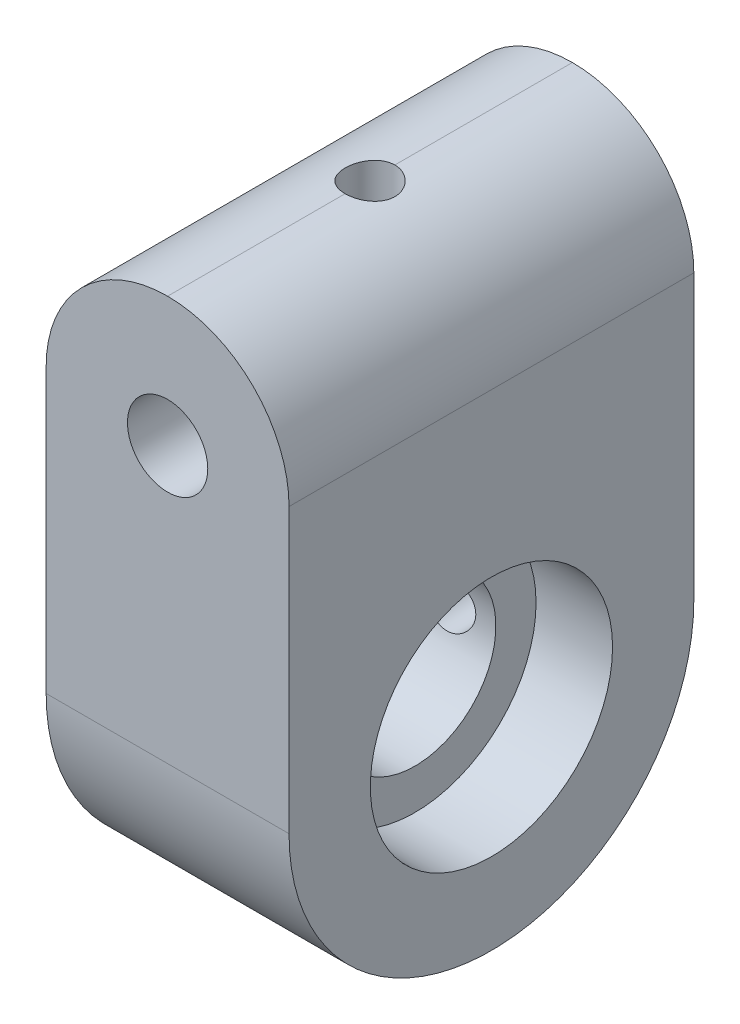
ISO-10303-21;
HEADER;
FILE_DESCRIPTION(('STEP AP214'),'2;1');
FILE_NAME('part.step','',(''),(''),'','','');
FILE_SCHEMA(('AUTOMOTIVE_DESIGN { 1 0 10303 214 1 1 1 1 }'));
ENDSEC;
DATA;
#1=APPLICATION_CONTEXT('core data for automotive mechanical design processes');
#2=APPLICATION_PROTOCOL_DEFINITION('international standard','automotive_design',2000,#1);
#3=PRODUCT_CONTEXT('',#1,'mechanical');
#4=PRODUCT('Part','Part','',(#3));
#5=PRODUCT_RELATED_PRODUCT_CATEGORY('part','',(#4));
#6=PRODUCT_DEFINITION_FORMATION('','',#4);
#7=PRODUCT_DEFINITION_CONTEXT('part definition',#1,'design');
#8=PRODUCT_DEFINITION('design','',#6,#7);
#9=PRODUCT_DEFINITION_SHAPE('','',#8);
#10=(LENGTH_UNIT() NAMED_UNIT(*) SI_UNIT(.MILLI.,.METRE.));
#11=(NAMED_UNIT(*) PLANE_ANGLE_UNIT() SI_UNIT($,.RADIAN.));
#12=(NAMED_UNIT(*) SI_UNIT($,.STERADIAN.) SOLID_ANGLE_UNIT());
#13=UNCERTAINTY_MEASURE_WITH_UNIT(LENGTH_MEASURE(1.E-05),#10,'distance_accuracy_value','');
#14=(GEOMETRIC_REPRESENTATION_CONTEXT(3) GLOBAL_UNCERTAINTY_ASSIGNED_CONTEXT((#13)) GLOBAL_UNIT_ASSIGNED_CONTEXT((#10,
#11,#12)) REPRESENTATION_CONTEXT('',''));
#15=CARTESIAN_POINT('',(0.,0.,0.));
#16=DIRECTION('',(0.,0.,1.));
#17=DIRECTION('',(1.,0.,0.));
#18=AXIS2_PLACEMENT_3D('',#15,#16,#17);
#19=CARTESIAN_POINT('',(6.,0.,0.));
#20=DIRECTION('',(-1.,0.,0.));
#21=DIRECTION('',(0.,0.,1.));
#22=AXIS2_PLACEMENT_3D('',#19,#20,#21);
#23=CYLINDRICAL_SURFACE('',#22,15.875);
#24=CARTESIAN_POINT('',(6.,0.,0.));
#25=DIRECTION('',(1.,0.,0.));
#26=DIRECTION('',(0.,0.,-1.));
#27=AXIS2_PLACEMENT_3D('',#24,#25,#26);
#28=CIRCLE('',#27,15.875);
#29=CARTESIAN_POINT('',(6.,0.,15.875));
#30=VERTEX_POINT('',#29);
#31=CARTESIAN_POINT('',(6.,0.,-15.875));
#32=VERTEX_POINT('',#31);
#33=EDGE_CURVE('E154',#30,#32,#28,.T.);
#34=ORIENTED_EDGE('',*,*,#33,.F.);
#35=DIRECTION('',(-1.,0.,0.));
#36=VECTOR('',#35,1.);
#37=CARTESIAN_POINT('',(50.9012806053458,0.,15.875));
#38=LINE('',#37,#36);
#39=CARTESIAN_POINT('',(-13.0500000112,0.,15.875));
#40=VERTEX_POINT('',#39);
#41=EDGE_CURVE('E130',#30,#40,#38,.T.);
#42=ORIENTED_EDGE('',*,*,#41,.T.);
#43=CARTESIAN_POINT('',(-13.0500000112,0.,0.));
#44=DIRECTION('',(-1.,0.,0.));
#45=DIRECTION('',(0.,0.,1.));
#46=AXIS2_PLACEMENT_3D('',#43,#44,#45);
#47=CIRCLE('',#46,15.875);
#48=CARTESIAN_POINT('',(-13.0500000112,0.,-15.875));
#49=VERTEX_POINT('',#48);
#50=EDGE_CURVE('E123',#49,#40,#47,.T.);
#51=ORIENTED_EDGE('',*,*,#50,.F.);
#52=DIRECTION('',(-1.,0.,0.));
#53=VECTOR('',#52,1.);
#54=CARTESIAN_POINT('',(50.9012806053458,0.,-15.875));
#55=LINE('',#54,#53);
#56=CARTESIAN_POINT('',(-5.4750000056,0.,-15.875));
#57=VERTEX_POINT('',#56);
#58=EDGE_CURVE('E107',#57,#49,#55,.T.);
#59=ORIENTED_EDGE('',*,*,#58,.F.);
#60=CARTESIAN_POINT('',(-5.4750000056,0.,-15.875));
#61=CARTESIAN_POINT('',(-5.47499536164466,0.109091635657176,-15.8749984996695));
#62=CARTESIAN_POINT('',(-5.46581453993797,0.218251818472943,-15.8738636145146));
#63=CARTESIAN_POINT('',(-5.4293347624982,0.433535697956955,-15.8694454930914));
#64=CARTESIAN_POINT('',(-5.40201678914125,0.539656085297117,-15.8661600018665));
#65=CARTESIAN_POINT('',(-5.3300787858362,0.745712449431408,-15.8578108676735));
#66=CARTESIAN_POINT('',(-5.28547028865571,0.84565249709462,-15.8527484101529));
#67=CARTESIAN_POINT('',(-5.18024247086433,1.03660848917392,-15.8414086787376));
#68=CARTESIAN_POINT('',(-5.11962593816166,1.12762598373223,-15.8351316164254));
#69=CARTESIAN_POINT('',(-4.98375758915348,1.29865705097452,-15.8220263564267));
#70=CARTESIAN_POINT('',(-4.90843760378764,1.37861628530336,-15.8151956818049));
#71=CARTESIAN_POINT('',(-4.74544670232929,1.52479318956466,-15.8017730760334));
#72=CARTESIAN_POINT('',(-4.65777516290659,1.59101016556668,-15.7951811569537));
#73=CARTESIAN_POINT('',(-4.47221782939643,1.70802443854119,-15.7829579712837));
#74=CARTESIAN_POINT('',(-4.37429979851413,1.7587709771967,-15.7773298929554));
#75=CARTESIAN_POINT('',(-4.17125080177959,1.84307971870168,-15.7677041311081));
#76=CARTESIAN_POINT('',(-4.06612010041798,1.87664255130086,-15.7637063878414));
#77=CARTESIAN_POINT('',(-3.85219320309525,1.92546638135259,-15.7578174905465));
#78=CARTESIAN_POINT('',(-3.74341821202189,1.94081899669899,-15.755915794494));
#79=CARTESIAN_POINT('',(-3.52482027996539,1.95307005739227,-15.7544020087318));
#80=CARTESIAN_POINT('',(-3.41499737989185,1.94996922022953,-15.7547898300032));
#81=CARTESIAN_POINT('',(-3.19805893685664,1.92547663300571,-15.7578016136163));
#82=CARTESIAN_POINT('',(-3.09093181393696,1.90418571907383,-15.760413248052));
#83=CARTESIAN_POINT('',(-2.88178257957178,1.84407463713728,-15.7675591624959));
#84=CARTESIAN_POINT('',(-2.7797605683515,1.80525412513567,-15.7720934802344));
#85=CARTESIAN_POINT('',(-2.58340382756519,1.71107715813541,-15.7825878564819));
#86=CARTESIAN_POINT('',(-2.4890903665214,1.65567679683265,-15.7885516921479));
#87=CARTESIAN_POINT('',(-2.31106096572575,1.52994416648238,-15.8012301856438));
#88=CARTESIAN_POINT('',(-2.22734549438724,1.45961123780799,-15.8079448766355));
#89=CARTESIAN_POINT('',(-2.07230309900676,1.30545071422877,-15.8214233193507));
#90=CARTESIAN_POINT('',(-2.00106258608573,1.22153618770746,-15.8281870994146));
#91=CARTESIAN_POINT('',(-1.8736648872185,1.04289405190826,-15.8409596477729));
#92=CARTESIAN_POINT('',(-1.8175077340502,0.948166419132862,-15.8469684144266));
#93=CARTESIAN_POINT('',(-1.72187112170528,0.750521045852015,-15.8575574594906));
#94=CARTESIAN_POINT('',(-1.68239697538903,0.647600708684002,-15.8621372827191));
#95=CARTESIAN_POINT('',(-1.62131499884889,0.436523797186398,-15.8693482491345));
#96=CARTESIAN_POINT('',(-1.59970636108679,0.328367459763015,-15.8719794803991));
#97=CARTESIAN_POINT('',(-1.57508056116937,0.110635972316938,-15.8749853589123));
#98=CARTESIAN_POINT('',(-1.5719443438791,0.00107447921691601,-15.8753744564066));
#99=CARTESIAN_POINT('',(-1.58403836447204,-0.21701253776651,-15.873891216281));
#100=CARTESIAN_POINT('',(-1.59926822495188,-0.325538082891355,-15.8720189251303));
#101=CARTESIAN_POINT('',(-1.64756318919314,-0.538121998648205,-15.8662323078876));
#102=CARTESIAN_POINT('',(-1.68057162316199,-0.64219343524101,-15.8623244714587));
#103=CARTESIAN_POINT('',(-1.7634278930777,-0.843323454737969,-15.8529043559146));
#104=CARTESIAN_POINT('',(-1.81327628286212,-0.940381806866221,-15.847392024031));
#105=CARTESIAN_POINT('',(-1.92868618305237,-1.12526286090958,-15.8353416402011));
#106=CARTESIAN_POINT('',(-1.99432482085716,-1.2130370868871,-15.8287986097111));
#107=CARTESIAN_POINT('',(-2.13934272313309,-1.37636534239346,-15.8154345942434));
#108=CARTESIAN_POINT('',(-2.21872251362216,-1.45191890389514,-15.8086135986326));
#109=CARTESIAN_POINT('',(-2.38949338641263,-1.58908269179694,-15.7954179414587));
#110=CARTESIAN_POINT('',(-2.48094803293327,-1.65061407254503,-15.7890459365447));
#111=CARTESIAN_POINT('',(-2.67296362719593,-1.75744240658827,-15.7775131259806));
#112=CARTESIAN_POINT('',(-2.77352439765049,-1.80273967586086,-15.7723522967571));
#113=CARTESIAN_POINT('',(-2.98064176687574,-1.87568590074765,-15.7638441327051));
#114=CARTESIAN_POINT('',(-3.08718243046343,-1.90337954340526,-15.7604922092417));
#115=CARTESIAN_POINT('',(-3.30344559671588,-1.94047640951428,-15.7559681160791));
#116=CARTESIAN_POINT('',(-3.41316795662422,-1.94988045229903,-15.7547958487364));
#117=CARTESIAN_POINT('',(-3.63189557078495,-1.95011649139227,-15.7547665705131));
#118=CARTESIAN_POINT('',(-3.74090071007582,-1.94107235440365,-15.7558941179715));
#119=CARTESIAN_POINT('',(-3.95582922295795,-1.90493081878887,-15.7603042506726));
#120=CARTESIAN_POINT('',(-4.06175259587284,-1.87783341620049,-15.7635868363882));
#121=CARTESIAN_POINT('',(-4.26749593795794,-1.80639285509962,-15.7719324520006));
#122=CARTESIAN_POINT('',(-4.36731792932482,-1.76205544674672,-15.7769948881996));
#123=CARTESIAN_POINT('',(-4.55812488651506,-1.65740566380039,-15.7883307988697));
#124=CARTESIAN_POINT('',(-4.64910975665133,-1.59709311625676,-15.7946042864518));
#125=CARTESIAN_POINT('',(-4.82029314883718,-1.46174491951955,-15.8077059122498));
#126=CARTESIAN_POINT('',(-4.90041841491918,-1.38661693345281,-15.8145373629613));
#127=CARTESIAN_POINT('',(-5.0469726766189,-1.22396249026511,-15.8279558236688));
#128=CARTESIAN_POINT('',(-5.11339843408993,-1.13643311006129,-15.8345427755717));
#129=CARTESIAN_POINT('',(-5.23087482894762,-0.951092682343062,-15.8467566948266));
#130=CARTESIAN_POINT('',(-5.28186804844329,-0.853245021387955,-15.8523800441809));
#131=CARTESIAN_POINT('',(-5.36662707321045,-0.650361636736411,-15.8619963033509));
#132=CARTESIAN_POINT('',(-5.40041166499573,-0.545333894213929,-15.8659909902084));
#133=CARTESIAN_POINT('',(-5.44167520319677,-0.3664648109537,-15.8709329735242));
#134=CARTESIAN_POINT('',(-5.45415412881192,-0.293752987277251,-15.8724507087471));
#135=CARTESIAN_POINT('',(-5.4708180695596,-0.147371200054018,-15.8744847252684));
#136=CARTESIAN_POINT('',(-5.47500314301086,-0.073701243248073,-15.8750010136086));
#137=CARTESIAN_POINT('',(-5.4750000056,0.,-15.875));
#138=B_SPLINE_CURVE_WITH_KNOTS('',3,(#60,#61,#62,#63,#64,#65,#66,#67,#68,#69,#70,#71,#72,#73,
#74,#75,#76,#77,#78,#79,#80,#81,#82,#83,#84,#85,#86,#87,#88,#89,#90,#91,#92,#93,#94,#95,#96,#97,
#98,#99,#100,#101,#102,#103,#104,#105,#106,#107,#108,#109,#110,#111,#112,#113,#114,#115,#116,
#117,#118,#119,#120,#121,#122,#123,#124,#125,#126,#127,#128,#129,#130,#131,#132,#133,#134,#135,
#136,#137),.UNSPECIFIED.,.T.,.F.,(4,2,2,2,2,2,2,2,2,2,2,2,2,2,2,2,2,2,2,2,2,2,2,2,2,2,2,2,2,2,2,
2,2,2,2,2,2,2,4),(0.,0.32700570713055,0.654354837194614,0.981486000299123,1.30856022881588,
1.63718850480973,1.96583337121433,2.29554519184131,2.62524492830033,2.95327877138885,
3.2812998602467,3.60751428578232,3.93373511315536,4.26082759112558,4.58793452099078,
4.9172245886302,5.2465153718495,5.57591094194032,5.90529162221993,6.23254709400879,
6.55979584116036,6.88600759251478,7.21223007346468,7.54007955036915,7.86794158028564,
8.1976040066352,8.5272600161543,8.85607581187646,9.18487687704404,9.51147753939167,
9.83807827341948,10.1645701677125,10.4910655968194,10.8196641592899,11.1483403036608,
11.4782246892999,11.8077481669054,12.0286715813092,12.2495934422709),.UNSPECIFIED.);
#139=CARTESIAN_POINT('',(-1.5750000056,0.,-15.875));
#140=VERTEX_POINT('',#139);
#141=EDGE_CURVE('E235',#140,#57,#138,.T.);
#142=ORIENTED_EDGE('',*,*,#141,.F.);
#143=EDGE_CURVE('E122',#32,#140,#55,.T.);
#144=ORIENTED_EDGE('',*,*,#143,.F.);
#145=EDGE_LOOP('',(#34,#42,#51,#59,#142,#144));
#146=FACE_BOUND('',#145,.T.);
#147=ADVANCED_FACE('F50',(#146),#23,.T.);
#148=CARTESIAN_POINT('',(-13.0500000112,0.,0.));
#149=DIRECTION('',(1.,0.,0.));
#150=DIRECTION('',(0.,0.,-1.));
#151=AXIS2_PLACEMENT_3D('',#148,#149,#150);
#152=CYLINDRICAL_SURFACE('',#151,6.35);
#153=CARTESIAN_POINT('',(0.,0.,0.));
#154=DIRECTION('',(-1.,0.,0.));
#155=DIRECTION('',(0.,0.,1.));
#156=AXIS2_PLACEMENT_3D('',#153,#154,#155);
#157=CIRCLE('',#156,6.35);
#158=CARTESIAN_POINT('',(0.,0.,6.35));
#159=VERTEX_POINT('',#158);
#160=EDGE_CURVE('E135',#159,#159,#157,.T.);
#161=ORIENTED_EDGE('',*,*,#160,.F.);
#162=EDGE_LOOP('',(#161));
#163=FACE_BOUND('',#162,.T.);
#164=CARTESIAN_POINT('',(-13.0500000112,0.,0.));
#165=DIRECTION('',(-1.,0.,0.));
#166=DIRECTION('',(0.,0.,1.));
#167=AXIS2_PLACEMENT_3D('',#164,#165,#166);
#168=CIRCLE('',#167,6.35);
#169=CARTESIAN_POINT('',(-13.0500000112,0.,6.35));
#170=VERTEX_POINT('',#169);
#171=EDGE_CURVE('E132',#170,#170,#168,.T.);
#172=ORIENTED_EDGE('',*,*,#171,.T.);
#173=EDGE_LOOP('',(#172));
#174=FACE_BOUND('',#173,.T.);
#175=CARTESIAN_POINT('',(-5.4750000056,0.,-6.35));
#176=CARTESIAN_POINT('',(-5.47499903929185,-0.10685702197562,-6.34999929048152));
#177=CARTESIAN_POINT('',(-5.46618758121172,-0.213723899749165,-6.34727713228411));
#178=CARTESIAN_POINT('',(-5.43126311789637,-0.424338171891169,-6.33668426785036));
#179=CARTESIAN_POINT('',(-5.40514565450392,-0.528084755247265,-6.32881223497419));
#180=CARTESIAN_POINT('',(-5.3365688272408,-0.729390606672548,-6.30878072058357));
#181=CARTESIAN_POINT('',(-5.29413424236146,-0.826958996477546,-6.29662774240005));
#182=CARTESIAN_POINT('',(-5.19423149426708,-1.01359557752246,-6.26929279151093));
#183=CARTESIAN_POINT('',(-5.13676112120291,-1.10266251665351,-6.25411037363855));
#184=CARTESIAN_POINT('',(-5.0066063456952,-1.27243450716524,-6.22182325193047));
#185=CARTESIAN_POINT('',(-4.93355341573577,-1.35284924415327,-6.2046777467149));
#186=CARTESIAN_POINT('',(-4.77509223957696,-1.50050025075162,-6.1706362559548));
#187=CARTESIAN_POINT('',(-4.6896817963784,-1.56773417197455,-6.1537403153694));
#188=CARTESIAN_POINT('',(-4.50644170031107,-1.68866881257438,-6.12167586144799));
#189=CARTESIAN_POINT('',(-4.40836542303657,-1.74201050422782,-6.1065578579964));
#190=CARTESIAN_POINT('',(-4.20409521352513,-1.83132362488033,-6.08037297849531));
#191=CARTESIAN_POINT('',(-4.09790334437821,-1.86729945160871,-6.06930507697048));
#192=CARTESIAN_POINT('',(-3.8836854325849,-1.91980407272773,-6.05289963632771));
#193=CARTESIAN_POINT('',(-3.77580345258552,-1.93686996258798,-6.04740423202039));
#194=CARTESIAN_POINT('',(-3.5585783509925,-1.95274788489144,-6.04229688079955));
#195=CARTESIAN_POINT('',(-3.44923560977308,-1.95156458020149,-6.04268343098262));
#196=CARTESIAN_POINT('',(-3.23660255362269,-1.93139856367352,-6.04915671909207));
#197=CARTESIAN_POINT('',(-3.13324017835135,-1.91309426212473,-6.05502618789535));
#198=CARTESIAN_POINT('',(-2.93113070073747,-1.8603041020309,-6.07145165234119));
#199=CARTESIAN_POINT('',(-2.83238407469411,-1.82581657757464,-6.08200813046144));
#200=CARTESIAN_POINT('',(-2.64067413477249,-1.74115087690002,-6.10678767788345));
#201=CARTESIAN_POINT('',(-2.54781298619583,-1.69075662313004,-6.12106073551808));
#202=CARTESIAN_POINT('',(-2.37164053264274,-1.57585808430315,-6.15164183362421));
#203=CARTESIAN_POINT('',(-2.28833164433789,-1.511350240534,-6.16795038689539));
#204=CARTESIAN_POINT('',(-2.12978771137665,-1.36670903330142,-6.20164071202246));
#205=CARTESIAN_POINT('',(-2.05506720756573,-1.28601432408454,-6.21903817875087));
#206=CARTESIAN_POINT('',(-1.9200963729012,-1.11302317547154,-6.25231375578088));
#207=CARTESIAN_POINT('',(-1.85984704178968,-1.02072593518431,-6.2681917610648));
#208=CARTESIAN_POINT('',(-1.7551961137514,-0.826182827218041,-6.29679643395933));
#209=CARTESIAN_POINT('',(-1.71091348447776,-0.723869217855409,-6.30949923681031));
#210=CARTESIAN_POINT('',(-1.64033866004621,-0.512765014172967,-6.33015011710953));
#211=CARTESIAN_POINT('',(-1.61404119730067,-0.403976326463155,-6.33809958665256));
#212=CARTESIAN_POINT('',(-1.58105098848711,-0.187380548545456,-6.34812577507342));
#213=CARTESIAN_POINT('',(-1.57366133727013,-0.0796891076742254,-6.35041115684845));
#214=CARTESIAN_POINT('',(-1.57673666981586,0.135404549714435,-6.34946662960656));
#215=CARTESIAN_POINT('',(-1.5871991443104,0.242806804754185,-6.34623749570169));
#216=CARTESIAN_POINT('',(-1.62512046339278,0.451610523346704,-6.33476366117706));
#217=CARTESIAN_POINT('',(-1.65216789270355,0.553094017998481,-6.32664044834104));
#218=CARTESIAN_POINT('',(-1.72199240792858,0.750056941485369,-6.30632427021869));
#219=CARTESIAN_POINT('',(-1.76477141528232,0.845535635231153,-6.29413080781287));
#220=CARTESIAN_POINT('',(-1.86598747962097,1.03030988548234,-6.26657015976483));
#221=CARTESIAN_POINT('',(-1.92477361691584,1.11940368779339,-6.25113422254715));
#222=CARTESIAN_POINT('',(-2.05591407739497,1.28669728772642,-6.21885688021126));
#223=CARTESIAN_POINT('',(-2.12827195948784,1.36489421847388,-6.20201510708607));
#224=CARTESIAN_POINT('',(-2.28777847808962,1.51127090969683,-6.16801653064182));
#225=CARTESIAN_POINT('',(-2.37538629920678,1.57895431123626,-6.15087224475373));
#226=CARTESIAN_POINT('',(-2.56108903600036,1.69869933795663,-6.11888678130346));
#227=CARTESIAN_POINT('',(-2.65918373440474,1.75076128670514,-6.10404555604099));
#228=CARTESIAN_POINT('',(-2.86282249521295,1.83744652051643,-6.0785143004682));
#229=CARTESIAN_POINT('',(-2.96833275399505,1.87214374230091,-6.06780671501397));
#230=CARTESIAN_POINT('',(-3.18409188824906,1.92316368451585,-6.05183195640018));
#231=CARTESIAN_POINT('',(-3.29433902477157,1.93949308909903,-6.04656280422151));
#232=CARTESIAN_POINT('',(-3.51126783340827,1.95284491675421,-6.04226283254466));
#233=CARTESIAN_POINT('',(-3.61789496000377,1.95067933577755,-6.04296963325239));
#234=CARTESIAN_POINT('',(-3.82918823287785,1.92905325125855,-6.04990740463003));
#235=CARTESIAN_POINT('',(-3.9338544646379,1.90959350342202,-6.05613813391998));
#236=CARTESIAN_POINT('',(-4.13685750606368,1.85446667596261,-6.07324154737814));
#237=CARTESIAN_POINT('',(-4.23526118935541,1.81902434948441,-6.0840497374683));
#238=CARTESIAN_POINT('',(-4.42480398099332,1.73311446894476,-6.10907577730168));
#239=CARTESIAN_POINT('',(-4.51594164432533,1.68264393558344,-6.12329430302559));
#240=CARTESIAN_POINT('',(-4.69210843044887,1.56586886224281,-6.15421232024008));
#241=CARTESIAN_POINT('',(-4.77677444867324,1.49903608299628,-6.17098548992044));
#242=CARTESIAN_POINT('',(-4.93395278725065,1.35237245273645,-6.20477587484821));
#243=CARTESIAN_POINT('',(-5.00646189004503,1.27253817161554,-6.22179315341405));
#244=CARTESIAN_POINT('',(-5.13952402760128,1.09914525609168,-6.2547898842979));
#245=CARTESIAN_POINT('',(-5.19963445069809,1.00523666715563,-6.27072051862999));
#246=CARTESIAN_POINT('',(-5.30313277380672,0.808157548135226,-6.29914827327942));
#247=CARTESIAN_POINT('',(-5.34652779933884,0.704990987759681,-6.31164685597444));
#248=CARTESIAN_POINT('',(-5.41188708798929,0.502390277836155,-6.33083434228695));
#249=CARTESIAN_POINT('',(-5.43548804031482,0.403523540351011,-6.33796038726546));
#250=CARTESIAN_POINT('',(-5.46704350046408,0.203107167071564,-6.34754311822479));
#251=CARTESIAN_POINT('',(-5.4750009239894,0.101558034808864,-6.35000067433381));
#252=CARTESIAN_POINT('',(-5.4750000056,0.,-6.35));
#253=B_SPLINE_CURVE_WITH_KNOTS('',3,(#175,#176,#177,#178,#179,#180,#181,#182,#183,#184,#185,
#186,#187,#188,#189,#190,#191,#192,#193,#194,#195,#196,#197,#198,#199,#200,#201,#202,#203,#204,
#205,#206,#207,#208,#209,#210,#211,#212,#213,#214,#215,#216,#217,#218,#219,#220,#221,#222,#223,
#224,#225,#226,#227,#228,#229,#230,#231,#232,#233,#234,#235,#236,#237,#238,#239,#240,#241,#242,
#243,#244,#245,#246,#247,#248,#249,#250,#251,#252),.UNSPECIFIED.,.T.,.F.,(4,2,2,2,2,2,2,2,2,2,2,
2,2,2,2,2,2,2,2,2,2,2,2,2,2,2,2,2,2,2,2,2,2,2,2,2,2,2,4),(0.,0.320197880477503,
0.640478278423643,0.960274210936354,1.28011717112342,1.60858650704229,1.93711431230156,
2.27343856473956,2.60967760172824,2.93610007634908,3.2624391478747,3.5763714219578,
3.89033601951986,4.20876370282161,4.52727176972217,4.85975292967604,5.19225705251384,
5.52718981719395,5.86202444299339,6.18432728185968,6.50658482205111,6.82115466765817,
7.13576294728491,7.45787392946324,7.78006949695777,8.11456477300648,8.44905312016714,
8.7821048782788,9.11503539771912,9.433426815897,9.75180432196109,10.0658379289335,
10.3799338336846,10.7059503715803,11.0320530601996,11.3683103422117,11.7044241237938,
12.0088002850447,12.3131197101048),.UNSPECIFIED.);
#254=CARTESIAN_POINT('',(-5.4750000056,0.,-6.35));
#255=VERTEX_POINT('',#254);
#256=EDGE_CURVE('E224',#255,#255,#253,.T.);
#257=ORIENTED_EDGE('',*,*,#256,.F.);
#258=EDGE_LOOP('',(#257));
#259=FACE_BOUND('',#258,.T.);
#260=ADVANCED_FACE('F256',(#163,#174,#259),#152,.F.);
#261=CARTESIAN_POINT('',(-13.0500000112,0.,0.));
#262=DIRECTION('',(-1.,0.,0.));
#263=DIRECTION('',(0.,0.,1.));
#264=AXIS2_PLACEMENT_3D('',#261,#262,#263);
#265=PLANE('',#264);
#266=ORIENTED_EDGE('',*,*,#171,.F.);
#267=EDGE_LOOP('',(#266));
#268=FACE_BOUND('',#267,.T.);
#269=DIRECTION('',(0.,1.,0.));
#270=VECTOR('',#269,1.);
#271=CARTESIAN_POINT('',(-13.0500000112,0.,15.875));
#272=LINE('',#271,#270);
#273=CARTESIAN_POINT('',(-13.0500000112,22.225,15.875));
#274=VERTEX_POINT('',#273);
#275=EDGE_CURVE('E212',#40,#274,#272,.T.);
#276=ORIENTED_EDGE('',*,*,#275,.T.);
#277=DIRECTION('',(0.,0.,1.));
#278=VECTOR('',#277,1.);
#279=CARTESIAN_POINT('',(-13.0500000112,22.225,-15.875));
#280=LINE('',#279,#278);
#281=CARTESIAN_POINT('',(-13.0500000112,22.225,-15.875));
#282=VERTEX_POINT('',#281);
#283=EDGE_CURVE('E11',#274,#282,#280,.F.);
#284=ORIENTED_EDGE('',*,*,#283,.T.);
#285=DIRECTION('',(0.,1.,0.));
#286=VECTOR('',#285,1.);
#287=CARTESIAN_POINT('',(-13.0500000112,0.,-15.875));
#288=LINE('',#287,#286);
#289=EDGE_CURVE('E111',#49,#282,#288,.T.);
#290=ORIENTED_EDGE('',*,*,#289,.F.);
#291=ORIENTED_EDGE('',*,*,#50,.T.);
#292=EDGE_LOOP('',(#276,#284,#290,#291));
#293=FACE_BOUND('',#292,.T.);
#294=CARTESIAN_POINT('',(-13.0500000112,12.7,0.));
#295=DIRECTION('',(-1.,0.,0.));
#296=DIRECTION('',(0.,0.,1.));
#297=AXIS2_PLACEMENT_3D('',#294,#295,#296);
#298=CIRCLE('',#297,1.95);
#299=CARTESIAN_POINT('',(-13.0500000112,12.7,1.95));
#300=VERTEX_POINT('',#299);
#301=EDGE_CURVE('E143',#300,#300,#298,.T.);
#302=ORIENTED_EDGE('',*,*,#301,.F.);
#303=EDGE_LOOP('',(#302));
#304=FACE_BOUND('',#303,.T.);
#305=CARTESIAN_POINT('',(-13.0500000112,-12.7,0.));
#306=DIRECTION('',(-1.,0.,0.));
#307=DIRECTION('',(0.,0.,1.));
#308=AXIS2_PLACEMENT_3D('',#305,#306,#307);
#309=CIRCLE('',#308,1.95);
#310=CARTESIAN_POINT('',(-13.0500000112,-12.7,1.95));
#311=VERTEX_POINT('',#310);
#312=EDGE_CURVE('E301',#311,#311,#309,.F.);
#313=ORIENTED_EDGE('',*,*,#312,.T.);
#314=EDGE_LOOP('',(#313));
#315=FACE_BOUND('',#314,.T.);
#316=ADVANCED_FACE('F124',(#268,#293,#304,#315),#265,.T.);
#317=CARTESIAN_POINT('',(6.,0.,0.));
#318=DIRECTION('',(1.,0.,0.));
#319=DIRECTION('',(0.,0.,-1.));
#320=AXIS2_PLACEMENT_3D('',#317,#318,#319);
#321=PLANE('',#320);
#322=DIRECTION('',(0.,1.,0.));
#323=VECTOR('',#322,1.);
#324=CARTESIAN_POINT('',(6.,0.,-15.875));
#325=LINE('',#324,#323);
#326=CARTESIAN_POINT('',(6.,22.225,-15.875));
#327=VERTEX_POINT('',#326);
#328=EDGE_CURVE('E209',#32,#327,#325,.T.);
#329=ORIENTED_EDGE('',*,*,#328,.T.);
#330=DIRECTION('',(0.,0.,1.));
#331=VECTOR('',#330,1.);
#332=CARTESIAN_POINT('',(6.,22.225,15.875));
#333=LINE('',#332,#331);
#334=CARTESIAN_POINT('',(6.,22.225,15.875));
#335=VERTEX_POINT('',#334);
#336=EDGE_CURVE('E156',#327,#335,#333,.T.);
#337=ORIENTED_EDGE('',*,*,#336,.T.);
#338=DIRECTION('',(0.,1.,0.));
#339=VECTOR('',#338,1.);
#340=CARTESIAN_POINT('',(6.,0.,15.875));
#341=LINE('',#340,#339);
#342=EDGE_CURVE('E118',#30,#335,#341,.T.);
#343=ORIENTED_EDGE('',*,*,#342,.F.);
#344=ORIENTED_EDGE('',*,*,#33,.T.);
#345=EDGE_LOOP('',(#329,#337,#343,#344));
#346=FACE_BOUND('',#345,.T.);
#347=CARTESIAN_POINT('',(6.,0.,0.));
#348=DIRECTION('',(1.,0.,0.));
#349=DIRECTION('',(0.,0.,-1.));
#350=AXIS2_PLACEMENT_3D('',#347,#348,#349);
#351=CIRCLE('',#350,9.5);
#352=CARTESIAN_POINT('',(6.,0.,-9.5));
#353=VERTEX_POINT('',#352);
#354=EDGE_CURVE('E149',#353,#353,#351,.T.);
#355=ORIENTED_EDGE('',*,*,#354,.F.);
#356=EDGE_LOOP('',(#355));
#357=FACE_BOUND('',#356,.T.);
#358=ADVANCED_FACE('F270',(#346,#357),#321,.T.);
#359=CARTESIAN_POINT('',(6.,0.,0.));
#360=DIRECTION('',(-1.,0.,0.));
#361=DIRECTION('',(0.,0.,1.));
#362=AXIS2_PLACEMENT_3D('',#359,#360,#361);
#363=CYLINDRICAL_SURFACE('',#362,9.5);
#364=ORIENTED_EDGE('',*,*,#354,.T.);
#365=EDGE_LOOP('',(#364));
#366=FACE_BOUND('',#365,.T.);
#367=CARTESIAN_POINT('',(0.,0.,0.));
#368=DIRECTION('',(1.,0.,0.));
#369=DIRECTION('',(0.,0.,-1.));
#370=AXIS2_PLACEMENT_3D('',#367,#368,#369);
#371=CIRCLE('',#370,9.5);
#372=CARTESIAN_POINT('',(0.,0.,-9.5));
#373=VERTEX_POINT('',#372);
#374=EDGE_CURVE('E136',#373,#373,#371,.T.);
#375=ORIENTED_EDGE('',*,*,#374,.F.);
#376=EDGE_LOOP('',(#375));
#377=FACE_BOUND('',#376,.T.);
#378=ADVANCED_FACE('F335',(#366,#377),#363,.F.);
#379=CARTESIAN_POINT('',(0.,0.,0.));
#380=DIRECTION('',(-1.,0.,0.));
#381=DIRECTION('',(0.,0.,1.));
#382=AXIS2_PLACEMENT_3D('',#379,#380,#381);
#383=PLANE('',#382);
#384=ORIENTED_EDGE('',*,*,#160,.T.);
#385=EDGE_LOOP('',(#384));
#386=FACE_BOUND('',#385,.T.);
#387=ORIENTED_EDGE('',*,*,#374,.T.);
#388=EDGE_LOOP('',(#387));
#389=FACE_BOUND('',#388,.T.);
#390=ADVANCED_FACE('F328',(#386,#389),#383,.F.);
#391=CARTESIAN_POINT('',(-2.8900000112,12.7,0.));
#392=DIRECTION('',(-1.,0.,0.));
#393=DIRECTION('',(0.,0.,1.));
#394=AXIS2_PLACEMENT_3D('',#391,#392,#393);
#395=CYLINDRICAL_SURFACE('',#394,1.95);
#396=CARTESIAN_POINT('',(-2.8900000112,12.7,0.));
#397=DIRECTION('',(-1.,0.,0.));
#398=DIRECTION('',(0.,0.,1.));
#399=AXIS2_PLACEMENT_3D('',#396,#397,#398);
#400=CIRCLE('',#399,1.95);
#401=CARTESIAN_POINT('',(-2.8900000112,12.7,1.95));
#402=VERTEX_POINT('',#401);
#403=EDGE_CURVE('E296',#402,#402,#400,.T.);
#404=ORIENTED_EDGE('',*,*,#403,.F.);
#405=EDGE_LOOP('',(#404));
#406=FACE_BOUND('',#405,.T.);
#407=ORIENTED_EDGE('',*,*,#301,.T.);
#408=EDGE_LOOP('',(#407));
#409=FACE_BOUND('',#408,.T.);
#410=ADVANCED_FACE('F325',(#406,#409),#395,.F.);
#411=CARTESIAN_POINT('',(-2.8900000112,0.,0.));
#412=DIRECTION('',(-1.,0.,0.));
#413=DIRECTION('',(0.,0.,1.));
#414=AXIS2_PLACEMENT_3D('',#411,#412,#413);
#415=PLANE('',#414);
#416=ORIENTED_EDGE('',*,*,#403,.T.);
#417=EDGE_LOOP('',(#416));
#418=FACE_BOUND('',#417,.T.);
#419=ADVANCED_FACE('F320',(#418),#415,.T.);
#420=CARTESIAN_POINT('',(-2.8900000112,-12.7,0.));
#421=DIRECTION('',(-1.,0.,0.));
#422=DIRECTION('',(0.,0.,1.));
#423=AXIS2_PLACEMENT_3D('',#420,#421,#422);
#424=CYLINDRICAL_SURFACE('',#423,1.95);
#425=CARTESIAN_POINT('',(-2.8900000112,-12.7,0.));
#426=DIRECTION('',(-1.,0.,0.));
#427=DIRECTION('',(0.,0.,1.));
#428=AXIS2_PLACEMENT_3D('',#425,#426,#427);
#429=CIRCLE('',#428,1.95);
#430=CARTESIAN_POINT('',(-2.8900000112,-12.7,1.95));
#431=VERTEX_POINT('',#430);
#432=EDGE_CURVE('E145',#431,#431,#429,.F.);
#433=ORIENTED_EDGE('',*,*,#432,.T.);
#434=EDGE_LOOP('',(#433));
#435=FACE_BOUND('',#434,.T.);
#436=ORIENTED_EDGE('',*,*,#312,.F.);
#437=EDGE_LOOP('',(#436));
#438=FACE_BOUND('',#437,.T.);
#439=ADVANCED_FACE('F308',(#435,#438),#424,.F.);
#440=CARTESIAN_POINT('',(-2.8900000112,0.,0.));
#441=DIRECTION('',(-1.,0.,0.));
#442=DIRECTION('',(0.,0.,1.));
#443=AXIS2_PLACEMENT_3D('',#440,#441,#442);
#444=PLANE('',#443);
#445=ORIENTED_EDGE('',*,*,#432,.F.);
#446=EDGE_LOOP('',(#445));
#447=FACE_BOUND('',#446,.T.);
#448=ADVANCED_FACE('F311',(#447),#444,.T.);
#449=CARTESIAN_POINT('',(-3.5250000056,0.,15.876));
#450=DIRECTION('',(0.,0.,-1.));
#451=DIRECTION('',(-1.,0.,0.));
#452=AXIS2_PLACEMENT_3D('',#449,#450,#451);
#453=CYLINDRICAL_SURFACE('',#452,1.95);
#454=ORIENTED_EDGE('',*,*,#256,.T.);
#455=EDGE_LOOP('',(#454));
#456=FACE_BOUND('',#455,.T.);
#457=EDGE_CURVE('E231',#57,#140,#138,.T.);
#458=ORIENTED_EDGE('',*,*,#457,.T.);
#459=ORIENTED_EDGE('',*,*,#141,.T.);
#460=EDGE_LOOP('',(#458,#459));
#461=FACE_BOUND('',#460,.T.);
#462=ADVANCED_FACE('F237',(#456,#461),#453,.F.);
#463=CARTESIAN_POINT('',(50.9012806053458,0.,15.875));
#464=DIRECTION('',(0.,0.,1.));
#465=DIRECTION('',(1.,0.,0.));
#466=AXIS2_PLACEMENT_3D('',#463,#464,#465);
#467=PLANE('',#466);
#468=CARTESIAN_POINT('',(-3.5250000056,21.59,15.875));
#469=DIRECTION('',(0.,0.,1.));
#470=DIRECTION('',(1.,0.,0.));
#471=AXIS2_PLACEMENT_3D('',#468,#469,#470);
#472=CIRCLE('',#471,3.15);
#473=CARTESIAN_POINT('',(-0.375000005599998,21.59,15.875));
#474=VERTEX_POINT('',#473);
#475=EDGE_CURVE('E205',#474,#474,#472,.T.);
#476=ORIENTED_EDGE('',*,*,#475,.F.);
#477=EDGE_LOOP('',(#476));
#478=FACE_BOUND('',#477,.T.);
#479=ORIENTED_EDGE('',*,*,#342,.T.);
#480=CARTESIAN_POINT('',(-3.525,22.225,15.875));
#481=DIRECTION('',(0.,0.,1.));
#482=DIRECTION('',(1.,0.,0.));
#483=AXIS2_PLACEMENT_3D('',#480,#481,#482);
#484=CIRCLE('',#483,9.525);
#485=CARTESIAN_POINT('',(-3.5250000112,31.75,15.875));
#486=VERTEX_POINT('',#485);
#487=EDGE_CURVE('E168',#335,#486,#484,.T.);
#488=ORIENTED_EDGE('',*,*,#487,.T.);
#489=CARTESIAN_POINT('',(-3.5250000112,22.225,15.875));
#490=DIRECTION('',(0.,0.,1.));
#491=DIRECTION('',(1.,0.,0.));
#492=AXIS2_PLACEMENT_3D('',#489,#490,#491);
#493=CIRCLE('',#492,9.525);
#494=EDGE_CURVE('E161',#486,#274,#493,.T.);
#495=ORIENTED_EDGE('',*,*,#494,.T.);
#496=ORIENTED_EDGE('',*,*,#275,.F.);
#497=ORIENTED_EDGE('',*,*,#41,.F.);
#498=EDGE_LOOP('',(#479,#488,#495,#496,#497));
#499=FACE_BOUND('',#498,.T.);
#500=ADVANCED_FACE('F242',(#478,#499),#467,.T.);
#501=CARTESIAN_POINT('',(50.9012806053458,0.,-15.875));
#502=DIRECTION('',(0.,0.,1.));
#503=DIRECTION('',(1.,0.,0.));
#504=AXIS2_PLACEMENT_3D('',#501,#502,#503);
#505=PLANE('',#504);
#506=CARTESIAN_POINT('',(-3.5250000056,21.59,-15.875));
#507=DIRECTION('',(0.,0.,1.));
#508=DIRECTION('',(1.,0.,0.));
#509=AXIS2_PLACEMENT_3D('',#506,#507,#508);
#510=CIRCLE('',#509,3.15);
#511=CARTESIAN_POINT('',(-0.375000005599998,21.59,-15.875));
#512=VERTEX_POINT('',#511);
#513=EDGE_CURVE('E207',#512,#512,#510,.F.);
#514=ORIENTED_EDGE('',*,*,#513,.F.);
#515=EDGE_LOOP('',(#514));
#516=FACE_BOUND('',#515,.T.);
#517=CARTESIAN_POINT('',(-3.5250000112,22.225,-15.875));
#518=DIRECTION('',(0.,0.,1.));
#519=DIRECTION('',(1.,0.,0.));
#520=AXIS2_PLACEMENT_3D('',#517,#518,#519);
#521=CIRCLE('',#520,9.525);
#522=CARTESIAN_POINT('',(-3.5250000112,31.75,-15.875));
#523=VERTEX_POINT('',#522);
#524=EDGE_CURVE('E68',#282,#523,#521,.F.);
#525=ORIENTED_EDGE('',*,*,#524,.T.);
#526=CARTESIAN_POINT('',(-3.525,22.225,-15.875));
#527=DIRECTION('',(0.,0.,1.));
#528=DIRECTION('',(1.,0.,0.));
#529=AXIS2_PLACEMENT_3D('',#526,#527,#528);
#530=CIRCLE('',#529,9.525);
#531=EDGE_CURVE('E59',#523,#327,#530,.F.);
#532=ORIENTED_EDGE('',*,*,#531,.T.);
#533=ORIENTED_EDGE('',*,*,#328,.F.);
#534=ORIENTED_EDGE('',*,*,#143,.T.);
#535=EDGE_CURVE('E113',#140,#57,#55,.T.);
#536=ORIENTED_EDGE('',*,*,#535,.T.);
#537=ORIENTED_EDGE('',*,*,#58,.T.);
#538=ORIENTED_EDGE('',*,*,#289,.T.);
#539=EDGE_LOOP('',(#525,#532,#533,#534,#536,#537,#538));
#540=FACE_BOUND('',#539,.T.);
#541=ADVANCED_FACE('F109',(#516,#540),#505,.F.);
#542=CARTESIAN_POINT('',(50.9012806053458,0.,0.));
#543=DIRECTION('',(-1.,0.,0.));
#544=DIRECTION('',(0.,0.,1.));
#545=AXIS2_PLACEMENT_3D('',#542,#543,#544);
#546=CYLINDRICAL_SURFACE('',#545,15.875);
#547=ORIENTED_EDGE('',*,*,#457,.F.);
#548=ORIENTED_EDGE('',*,*,#535,.F.);
#549=EDGE_LOOP('',(#547,#548));
#550=FACE_BOUND('',#549,.T.);
#551=ADVANCED_FACE('F248',(#550),#546,.F.);
#552=CARTESIAN_POINT('',(-3.5250000056,21.59,-24.7845454429505));
#553=DIRECTION('',(0.,0.,1.));
#554=DIRECTION('',(1.,0.,0.));
#555=AXIS2_PLACEMENT_3D('',#552,#553,#554);
#556=CYLINDRICAL_SURFACE('',#555,3.15);
#557=CARTESIAN_POINT('',(-3.5250000056,24.74,1.95));
#558=CARTESIAN_POINT('',(-3.62423530605037,24.7399928691529,1.9499922057761));
#559=CARTESIAN_POINT('',(-3.72360255491586,24.7352606351288,1.94237251299018));
#560=CARTESIAN_POINT('',(-3.91930165959853,24.7167776928205,1.91229540502733));
#561=CARTESIAN_POINT('',(-4.01562689032314,24.7030085559057,1.88980766929265));
#562=CARTESIAN_POINT('',(-4.20201918903116,24.6678397589278,1.83129470549098));
#563=CARTESIAN_POINT('',(-4.29211468291988,24.6464779267164,1.79533654186083));
#564=CARTESIAN_POINT('',(-4.46468814000509,24.5979119155241,1.7113462437159));
#565=CARTESIAN_POINT('',(-4.54716718666193,24.5707085693509,1.66331583014065));
#566=CARTESIAN_POINT('',(-4.70954428420935,24.5101784538048,1.55234599970783));
#567=CARTESIAN_POINT('',(-4.78872249112529,24.4765375707552,1.48852797028438));
#568=CARTESIAN_POINT('',(-4.93595154046623,24.4075065147286,1.34980233489642));
#569=CARTESIAN_POINT('',(-5.00398733479429,24.3721140588026,1.27487998805877));
#570=CARTESIAN_POINT('',(-5.13615658543223,24.2979766560378,1.10444594459473));
#571=CARTESIAN_POINT('',(-5.19858206117301,24.2594078926808,1.00752163495528));
#572=CARTESIAN_POINT('',(-5.30606098429747,24.1889354376646,0.802296496269889));
#573=CARTESIAN_POINT('',(-5.35114353780165,24.1570206204888,0.694015119686411));
#574=CARTESIAN_POINT('',(-5.41259223095483,24.1120151852677,0.497234001653764));
#575=CARTESIAN_POINT('',(-5.43334982900401,24.0961995391122,0.41073258695842));
#576=CARTESIAN_POINT('',(-5.46288579273509,24.0734368798423,0.234613590978167));
#577=CARTESIAN_POINT('',(-5.47168057656667,24.0664777126591,0.145000454011513));
#578=CARTESIAN_POINT('',(-5.47676870805966,24.062470991763,-0.0350308827813136));
#579=CARTESIAN_POINT('',(-5.47303140144101,24.0654477418458,-0.125450516319703));
#580=CARTESIAN_POINT('',(-5.45323793262467,24.0808925727401,-0.304126200176456));
#581=CARTESIAN_POINT('',(-5.43717202974812,24.093368158409,-0.392380482750985));
#582=CARTESIAN_POINT('',(-5.39407289833654,24.1256979976706,-0.562705714224796));
#583=CARTESIAN_POINT('',(-5.36726893888627,24.145397315249,-0.644865818725491));
#584=CARTESIAN_POINT('',(-5.30373150957707,24.1900227302106,-0.803704455827502));
#585=CARTESIAN_POINT('',(-5.2669945009723,24.2149506896375,-0.88038102253085));
#586=CARTESIAN_POINT('',(-5.17685764413035,24.2727650678329,-1.04107917717203));
#587=CARTESIAN_POINT('',(-5.12163544217216,24.3062718204192,-1.12385522807219));
#588=CARTESIAN_POINT('',(-4.99954360870611,24.3744426184056,-1.27986258590528));
#589=CARTESIAN_POINT('',(-4.93266218028757,24.4091078069279,-1.35308409298552));
#590=CARTESIAN_POINT('',(-4.77660300526916,24.4821500128074,-1.49973100727668));
#591=CARTESIAN_POINT('',(-4.68557139995576,24.5202437902548,-1.5713470395437));
#592=CARTESIAN_POINT('',(-4.49052337347606,24.5901626954663,-1.69816685123574));
#593=CARTESIAN_POINT('',(-4.38651259353337,24.6219905312398,-1.75337772590541));
#594=CARTESIAN_POINT('',(-4.17416101190695,24.6742098311429,-1.84216276751809));
#595=CARTESIAN_POINT('',(-4.06639815860668,24.6951464682345,-1.87678438002747));
#596=CARTESIAN_POINT('',(-3.84501119721934,24.725684734243,-1.92689463644725));
#597=CARTESIAN_POINT('',(-3.73139529226498,24.7353017996124,-1.94240933771346));
#598=CARTESIAN_POINT('',(-3.51953139209473,24.7415143239743,-1.95244590079086));
#599=CARTESIAN_POINT('',(-3.42145125632477,24.7398000293192,-1.94969247841794));
#600=CARTESIAN_POINT('',(-3.22738110298425,24.7274143392599,-1.92961989827625));
#601=CARTESIAN_POINT('',(-3.13139097054298,24.71674343741,-1.91230154310855));
#602=CARTESIAN_POINT('',(-2.94755503257789,24.6879705382718,-1.86487529312099));
#603=CARTESIAN_POINT('',(-2.85954124817477,24.6701447359818,-1.83524144299285));
#604=CARTESIAN_POINT('',(-2.68980839577908,24.6285192095683,-1.76448750206163));
#605=CARTESIAN_POINT('',(-2.60809042452673,24.6047184476591,-1.72336541573631));
#606=CARTESIAN_POINT('',(-2.44424209873411,24.550178586624,-1.62617344166918));
#607=CARTESIAN_POINT('',(-2.36291732475271,24.5189797277938,-1.56900774297299));
#608=CARTESIAN_POINT('',(-2.21043097538769,24.4537913133343,-1.44366488003057));
#609=CARTESIAN_POINT('',(-2.13928104980938,24.4197986278767,-1.37547528109691));
#610=CARTESIAN_POINT('',(-1.99871844185847,24.3468247046636,-1.21883560196523));
#611=CARTESIAN_POINT('',(-1.93098303614557,24.3078196544329,-1.12888367725699));
#612=CARTESIAN_POINT('',(-1.81138299991618,24.2340417274558,-0.937407086543287));
#613=CARTESIAN_POINT('',(-1.75950587631712,24.1992655323117,-0.835891617242818));
#614=CARTESIAN_POINT('',(-1.68273102370032,24.1454380439955,-0.64554027102841));
#615=CARTESIAN_POINT('',(-1.65444525482334,24.124616058101,-0.558578671255916));
#616=CARTESIAN_POINT('',(-1.61019804231367,24.0913619509733,-0.380077080082007));
#617=CARTESIAN_POINT('',(-1.5942177804239,24.0789170227665,-0.288544308373311));
#618=CARTESIAN_POINT('',(-1.57546620649055,24.0642621689772,-0.102796575857267));
#619=CARTESIAN_POINT('',(-1.5727637806432,24.0621056217936,-0.00857017281134764));
#620=CARTESIAN_POINT('',(-1.58095906064119,24.0685533455534,0.178935131273829));
#621=CARTESIAN_POINT('',(-1.5918621777371,24.0771618980378,0.272213640434038));
#622=CARTESIAN_POINT('',(-1.62525910221491,24.1027427015133,0.448260617006762));
#623=CARTESIAN_POINT('',(-1.64685712482697,24.1190646855169,0.531301188956747));
#624=CARTESIAN_POINT('',(-1.70014756695476,24.1577799928179,0.692555694413177));
#625=CARTESIAN_POINT('',(-1.73184404123834,24.1801757543426,0.770767674040441));
#626=CARTESIAN_POINT('',(-1.80977521230822,24.2325390183357,0.932587180741696));
#627=CARTESIAN_POINT('',(-1.85746536629943,24.2631362283825,1.01528667992213));
#628=CARTESIAN_POINT('',(-1.9638543839734,24.3266349116192,1.17232018454148));
#629=CARTESIAN_POINT('',(-2.02256227757819,24.3595382609172,1.24664724756518));
#630=CARTESIAN_POINT('',(-2.162344214,24.4312923086105,1.39939851623755));
#631=CARTESIAN_POINT('',(-2.24554846402468,24.4700858364039,1.4759203444026));
#632=CARTESIAN_POINT('',(-2.42518581535385,24.5433603659215,1.61424058801354));
#633=CARTESIAN_POINT('',(-2.5216261568255,24.5778389875128,1.67603089430523));
#634=CARTESIAN_POINT('',(-2.72535267666977,24.6386431015491,1.78216458966691));
#635=CARTESIAN_POINT('',(-2.83256135976314,24.6650219882131,1.826622782146));
#636=CARTESIAN_POINT('',(-2.99917908902245,24.6963204786694,1.87867191448548));
#637=CARTESIAN_POINT('',(-3.05562833768589,24.7053702289463,1.89357456386549));
#638=CARTESIAN_POINT('',(-3.17000645546084,24.7204621420535,1.91830450057862));
#639=CARTESIAN_POINT('',(-3.22793416329554,24.7265065933787,1.92813565000551));
#640=CARTESIAN_POINT('',(-3.32580882639132,24.7339459130848,1.94020868522678));
#641=CARTESIAN_POINT('',(-3.36552116474119,24.7362119414929,1.94387615653298));
#642=CARTESIAN_POINT('',(-3.44514853911649,24.739240465171,1.94877345579746));
#643=CARTESIAN_POINT('',(-3.48506358722281,24.7400028697499,1.95000313672035));
#644=CARTESIAN_POINT('',(-3.5250000056,24.74,1.95));
#645=B_SPLINE_CURVE_WITH_KNOTS('',3,(#557,#558,#559,#560,#561,#562,#563,#564,#565,#566,#567,
#568,#569,#570,#571,#572,#573,#574,#575,#576,#577,#578,#579,#580,#581,#582,#583,#584,#585,#586,
#587,#588,#589,#590,#591,#592,#593,#594,#595,#596,#597,#598,#599,#600,#601,#602,#603,#604,#605,
#606,#607,#608,#609,#610,#611,#612,#613,#614,#615,#616,#617,#618,#619,#620,#621,#622,#623,#624,
#625,#626,#627,#628,#629,#630,#631,#632,#633,#634,#635,#636,#637,#638,#639,#640,#641,#642,#643,
#644),.UNSPECIFIED.,.T.,.F.,(4,2,2,2,2,2,2,2,2,2,2,2,2,2,2,2,2,2,2,2,2,2,2,2,2,2,2,2,2,2,2,2,2,
2,2,2,2,2,2,2,2,2,2,4),(0.,0.297544674254619,0.595698013878419,0.892386267447728,
1.18903225107996,1.50913593664668,1.82966842723728,2.1926198177626,2.55495939213585,
2.8248855372941,3.09444085210422,3.36465599663367,3.63508485506165,3.90002373359547,
4.16505712384406,4.47887010394222,4.79300246554831,5.15695489127978,5.52074967738763,
5.86396126140058,6.20670426494761,6.49960503762451,6.79248967105287,7.07501470806381,
7.35758885060343,7.66894119826256,7.98064722601339,8.33655753401257,8.69218673058113,
8.97242441767329,9.2522326941096,9.53349111063994,9.81486142604699,10.0758719129674,
10.3369873341493,10.6366508181776,10.936560981618,11.2934246018156,11.6504842109197,
12.0051368477055,12.1821208333342,12.3589698408373,12.4787069897407,12.598451360373),.UNSPECIFIED.);
#646=CARTESIAN_POINT('',(-3.5250000056,24.74,1.95));
#647=VERTEX_POINT('',#646);
#648=EDGE_CURVE('E193',#647,#647,#645,.T.);
#649=ORIENTED_EDGE('',*,*,#648,.F.);
#650=EDGE_LOOP('',(#649));
#651=FACE_BOUND('',#650,.T.);
#652=ORIENTED_EDGE('',*,*,#513,.T.);
#653=EDGE_LOOP('',(#652));
#654=FACE_BOUND('',#653,.T.);
#655=ORIENTED_EDGE('',*,*,#475,.T.);
#656=EDGE_LOOP('',(#655));
#657=FACE_BOUND('',#656,.T.);
#658=ADVANCED_FACE('F189',(#651,#654,#657),#556,.F.);
#659=CARTESIAN_POINT('',(-3.5250000056,-15.876,0.));
#660=DIRECTION('',(0.,1.,0.));
#661=DIRECTION('',(0.,0.,1.));
#662=AXIS2_PLACEMENT_3D('',#659,#660,#661);
#663=CYLINDRICAL_SURFACE('',#662,1.95);
#664=ORIENTED_EDGE('',*,*,#648,.T.);
#665=EDGE_LOOP('',(#664));
#666=FACE_BOUND('',#665,.T.);
#667=CARTESIAN_POINT('',(-3.5250000112,31.75,-1.95));
#668=CARTESIAN_POINT('',(-3.57925937251431,31.7500025634033,-1.95000028824502));
#669=CARTESIAN_POINT('',(-3.63349220441305,31.749535790632,-1.94773388554222));
#670=CARTESIAN_POINT('',(-3.74155904240129,31.7476908238452,-1.93869657101452));
#671=CARTESIAN_POINT('',(-3.79539309622513,31.7463127407579,-1.93192620742769));
#672=CARTESIAN_POINT('',(-3.9555404297524,31.7408610001205,-1.90494510791284));
#673=CARTESIAN_POINT('',(-4.06076392630535,31.7354695909126,-1.8780640366292));
#674=CARTESIAN_POINT('',(-4.2650867254221,31.7217581180302,-1.8073403031451));
#675=CARTESIAN_POINT('',(-4.36418529957342,31.713437706806,-1.76349562801543));
#676=CARTESIAN_POINT('',(-4.55364576523721,31.6947717880367,-1.66012922802037));
#677=CARTESIAN_POINT('',(-4.64400676838026,31.6844260748971,-1.60060591135698));
#678=CARTESIAN_POINT('',(-4.81466282933282,31.6626851431206,-1.46669138672862));
#679=CARTESIAN_POINT('',(-4.89481716446423,31.6512783722314,-1.39212278510576));
#680=CARTESIAN_POINT('',(-5.04157984440819,31.6287830307711,-1.23060716136497));
#681=CARTESIAN_POINT('',(-5.10818591932121,31.6176945137876,-1.14365806913935));
#682=CARTESIAN_POINT('',(-5.2265597972588,31.5969783132255,-0.95882776946113));
#683=CARTESIAN_POINT('',(-5.27817977848872,31.5873655962314,-0.860850066310048));
#684=CARTESIAN_POINT('',(-5.36416676579722,31.5708557646591,-0.657387855548609));
#685=CARTESIAN_POINT('',(-5.39853650868932,31.5639582193464,-0.551904541764814));
#686=CARTESIAN_POINT('',(-5.44858894508837,31.5537770048607,-0.33794975690352));
#687=CARTESIAN_POINT('',(-5.46452106557596,31.5504451461897,-0.229538977116585));
#688=CARTESIAN_POINT('',(-5.47802106219652,31.5476275692322,-0.0115333587439995));
#689=CARTESIAN_POINT('',(-5.47559048014024,31.5481415280344,0.0980613796598565));
#690=CARTESIAN_POINT('',(-5.45263482012062,31.5529139095256,0.313486329402552));
#691=CARTESIAN_POINT('',(-5.43239708626486,31.5571128666452,0.419348674802832));
#692=CARTESIAN_POINT('',(-5.37485573011634,31.5686883600883,0.626142290299024));
#693=CARTESIAN_POINT('',(-5.3375513846592,31.5760650310606,0.727073351240771));
#694=CARTESIAN_POINT('',(-5.24666335632814,31.5932251871598,0.921964803825718));
#695=CARTESIAN_POINT('',(-5.19296636029351,31.6030253318583,1.01587082360836));
#696=CARTESIAN_POINT('',(-5.07089871126731,31.6239172162469,1.19344386068093));
#697=CARTESIAN_POINT('',(-5.00252675706033,31.6350090704319,1.27710996897341));
#698=CARTESIAN_POINT('',(-4.85152587279917,31.6574905125056,1.43347907606101));
#699=CARTESIAN_POINT('',(-4.76865356606149,31.668881782456,1.50594698763139));
#700=CARTESIAN_POINT('',(-4.59178064536212,31.6904913919751,1.63601001483519));
#701=CARTESIAN_POINT('',(-4.49777704368094,31.7007094151797,1.69360112417148));
#702=CARTESIAN_POINT('',(-4.30102909970208,31.7188498099242,1.79232446367475));
#703=CARTESIAN_POINT('',(-4.19826564831782,31.7267669875121,1.83341953396911));
#704=CARTESIAN_POINT('',(-3.98716093086732,31.7393658132233,1.89764018210965));
#705=CARTESIAN_POINT('',(-3.87882815291773,31.7440522368794,1.92079228863264));
#706=CARTESIAN_POINT('',(-3.72885290297044,31.7479058325768,1.9397486630808));
#707=CARTESIAN_POINT('',(-3.68814548801716,31.7486903511646,1.94359422541065));
#708=CARTESIAN_POINT('',(-3.60663152756558,31.7497369919467,1.9487166868745));
#709=CARTESIAN_POINT('',(-3.5658252648322,31.7499999924868,1.94999790493605));
#710=CARTESIAN_POINT('',(-3.5250000112,31.75,1.95));
#711=B_SPLINE_CURVE_WITH_KNOTS('',3,(#667,#668,#669,#670,#671,#672,#673,#674,#675,#676,#677,
#678,#679,#680,#681,#682,#683,#684,#685,#686,#687,#688,#689,#690,#691,#692,#693,#694,#695,#696,
#697,#698,#699,#700,#701,#702,#703,#704,#705,#706,#707,#708,#709,#710),.UNSPECIFIED.,.F.,.F.,(4,
2,2,2,2,2,2,2,2,2,2,2,2,2,2,2,2,2,2,2,2,4),(0.,0.162676376245663,0.325332954569237,
0.649861258326938,0.974428082964954,1.29902787245467,1.62770567811499,1.95643850576252,
2.28831158192544,2.62013198855183,2.94740897505838,3.27465848230004,3.59672224227436,
3.91879965033661,4.24315584073023,4.56754080338752,4.89801063082528,5.22856936065654,
5.559868601644,5.89067707717656,6.0133007343147,6.13571769149565),.UNSPECIFIED.);
#712=CARTESIAN_POINT('',(-3.5250000112,31.75,-1.95));
#713=VERTEX_POINT('',#712);
#714=CARTESIAN_POINT('',(-3.5250000056,31.75,1.95));
#715=VERTEX_POINT('',#714);
#716=EDGE_CURVE('E169',#713,#715,#711,.T.);
#717=ORIENTED_EDGE('',*,*,#716,.T.);
#718=CARTESIAN_POINT('',(-3.525,31.75,1.95));
#719=CARTESIAN_POINT('',(-3.47074063868569,31.7500025634033,1.95000028824502));
#720=CARTESIAN_POINT('',(-3.41650780678695,31.749535790632,1.94773388554222));
#721=CARTESIAN_POINT('',(-3.30844096879871,31.7476908238452,1.93869657101452));
#722=CARTESIAN_POINT('',(-3.25460691497487,31.7463127407579,1.93192620742769));
#723=CARTESIAN_POINT('',(-3.0944595814476,31.7408610001205,1.90494510791284));
#724=CARTESIAN_POINT('',(-2.98923608489465,31.7354695909126,1.8780640366292));
#725=CARTESIAN_POINT('',(-2.7849132857779,31.7217581180302,1.8073403031451));
#726=CARTESIAN_POINT('',(-2.68581471162658,31.713437706806,1.76349562801543));
#727=CARTESIAN_POINT('',(-2.49635424596279,31.6947717880367,1.66012922802037));
#728=CARTESIAN_POINT('',(-2.40599324281974,31.6844260748971,1.60060591135698));
#729=CARTESIAN_POINT('',(-2.23533718186718,31.6626851431206,1.46669138672862));
#730=CARTESIAN_POINT('',(-2.15518284673577,31.6512783722314,1.39212278510576));
#731=CARTESIAN_POINT('',(-2.00842016679181,31.6287830307711,1.23060716136497));
#732=CARTESIAN_POINT('',(-1.94181409187879,31.6176945137876,1.14365806913935));
#733=CARTESIAN_POINT('',(-1.8234402139412,31.5969783132255,0.95882776946113));
#734=CARTESIAN_POINT('',(-1.77182023271128,31.5873655962314,0.860850066310048));
#735=CARTESIAN_POINT('',(-1.68583324540278,31.5708557646591,0.65738785554861));
#736=CARTESIAN_POINT('',(-1.65146350251068,31.5639582193464,0.551904541764815));
#737=CARTESIAN_POINT('',(-1.60141106611163,31.5537770048607,0.337949756903521));
#738=CARTESIAN_POINT('',(-1.58547894562404,31.5504451461897,0.229538977116586));
#739=CARTESIAN_POINT('',(-1.57197894900348,31.5476275692322,0.0115333587440007));
#740=CARTESIAN_POINT('',(-1.57440953105976,31.5481415280344,-0.0980613796598551));
#741=CARTESIAN_POINT('',(-1.59736519107938,31.5529139095256,-0.31348632940255));
#742=CARTESIAN_POINT('',(-1.61760292493514,31.5571128666452,-0.419348674802831));
#743=CARTESIAN_POINT('',(-1.67514428108366,31.5686883600883,-0.626142290299022));
#744=CARTESIAN_POINT('',(-1.7124486265408,31.5760650310606,-0.72707335124077));
#745=CARTESIAN_POINT('',(-1.80333665487186,31.5932251871598,-0.921964803825716));
#746=CARTESIAN_POINT('',(-1.85703365090649,31.6030253318583,-1.01587082360835));
#747=CARTESIAN_POINT('',(-1.97910129993269,31.6239172162469,-1.19344386068093));
#748=CARTESIAN_POINT('',(-2.04747325413967,31.6350090704319,-1.27710996897341));
#749=CARTESIAN_POINT('',(-2.19847413840083,31.6574905125056,-1.43347907606101));
#750=CARTESIAN_POINT('',(-2.28134644513851,31.668881782456,-1.50594698763138));
#751=CARTESIAN_POINT('',(-2.45821936583788,31.6904913919751,-1.63601001483519));
#752=CARTESIAN_POINT('',(-2.55222296751906,31.7007094151797,-1.69360112417148));
#753=CARTESIAN_POINT('',(-2.74897091149792,31.7188498099242,-1.79232446367475));
#754=CARTESIAN_POINT('',(-2.85173436288218,31.7267669875121,-1.83341953396911));
#755=CARTESIAN_POINT('',(-3.06283908033268,31.7393658132233,-1.89764018210965));
#756=CARTESIAN_POINT('',(-3.17117185828227,31.7440522368794,-1.92079228863264));
#757=CARTESIAN_POINT('',(-3.32114710822956,31.7479058325768,-1.9397486630808));
#758=CARTESIAN_POINT('',(-3.36185452318284,31.7486903511646,-1.94359422541065));
#759=CARTESIAN_POINT('',(-3.44336848363442,31.7497369919467,-1.9487166868745));
#760=CARTESIAN_POINT('',(-3.4841747463678,31.7499999924868,-1.94999790493605));
#761=CARTESIAN_POINT('',(-3.525,31.75,-1.95));
#762=B_SPLINE_CURVE_WITH_KNOTS('',3,(#718,#719,#720,#721,#722,#723,#724,#725,#726,#727,#728,
#729,#730,#731,#732,#733,#734,#735,#736,#737,#738,#739,#740,#741,#742,#743,#744,#745,#746,#747,
#748,#749,#750,#751,#752,#753,#754,#755,#756,#757,#758,#759,#760,#761),.UNSPECIFIED.,.F.,.F.,(4,
2,2,2,2,2,2,2,2,2,2,2,2,2,2,2,2,2,2,2,2,4),(0.,0.162676376245663,0.325332954569237,
0.649861258326937,0.974428082964953,1.29902787245467,1.62770567811499,1.95643850576252,
2.28831158192544,2.62013198855183,2.94740897505838,3.27465848230004,3.59672224227436,
3.91879965033661,4.24315584073023,4.56754080338751,4.89801063082528,5.22856936065653,
5.55986860164399,5.89067707717656,6.0133007343147,6.13571769149565),.UNSPECIFIED.);
#763=EDGE_CURVE('E180',#715,#713,#762,.T.);
#764=ORIENTED_EDGE('',*,*,#763,.T.);
#765=EDGE_LOOP('',(#717,#764));
#766=FACE_BOUND('',#765,.T.);
#767=ADVANCED_FACE('F182',(#666,#766),#663,.F.);
#768=CARTESIAN_POINT('',(-3.5250000112,22.225,0.));
#769=DIRECTION('',(0.,0.,-1.));
#770=DIRECTION('',(-1.,0.,0.));
#771=AXIS2_PLACEMENT_3D('',#768,#769,#770);
#772=CYLINDRICAL_SURFACE('',#771,9.525);
#773=DIRECTION('',(0.,0.,1.));
#774=VECTOR('',#773,1.);
#775=CARTESIAN_POINT('',(-3.5250000112,31.75,15.875));
#776=LINE('',#775,#774);
#777=EDGE_CURVE('E55',#715,#486,#776,.T.);
#778=ORIENTED_EDGE('',*,*,#777,.F.);
#779=ORIENTED_EDGE('',*,*,#716,.F.);
#780=DIRECTION('',(0.,0.,1.));
#781=VECTOR('',#780,1.);
#782=CARTESIAN_POINT('',(-3.5250000112,31.75,15.875));
#783=LINE('',#782,#781);
#784=EDGE_CURVE('E284',#523,#713,#783,.T.);
#785=ORIENTED_EDGE('',*,*,#784,.F.);
#786=ORIENTED_EDGE('',*,*,#524,.F.);
#787=ORIENTED_EDGE('',*,*,#283,.F.);
#788=ORIENTED_EDGE('',*,*,#494,.F.);
#789=EDGE_LOOP('',(#778,#779,#785,#786,#787,#788));
#790=FACE_BOUND('',#789,.T.);
#791=ADVANCED_FACE('F47',(#790),#772,.T.);
#792=CARTESIAN_POINT('',(-3.525,22.225,0.));
#793=DIRECTION('',(0.,0.,-1.));
#794=DIRECTION('',(-1.,0.,0.));
#795=AXIS2_PLACEMENT_3D('',#792,#793,#794);
#796=CYLINDRICAL_SURFACE('',#795,9.525);
#797=ORIENTED_EDGE('',*,*,#763,.F.);
#798=ORIENTED_EDGE('',*,*,#777,.T.);
#799=ORIENTED_EDGE('',*,*,#487,.F.);
#800=ORIENTED_EDGE('',*,*,#336,.F.);
#801=ORIENTED_EDGE('',*,*,#531,.F.);
#802=ORIENTED_EDGE('',*,*,#784,.T.);
#803=EDGE_LOOP('',(#797,#798,#799,#800,#801,#802));
#804=FACE_BOUND('',#803,.T.);
#805=ADVANCED_FACE('F266',(#804),#796,.T.);
#806=CLOSED_SHELL('',(#147,#260,#316,#358,#378,#390,#410,#419,#439,#448,#462,#500,#541,#551,
#658,#767,#791,#805));
#807=MANIFOLD_SOLID_BREP('B2',#806);
#808=ADVANCED_BREP_SHAPE_REPRESENTATION('',(#18,#807),#14);
#809=SHAPE_DEFINITION_REPRESENTATION(#9,#808);
ENDSEC;
END-ISO-10303-21;
